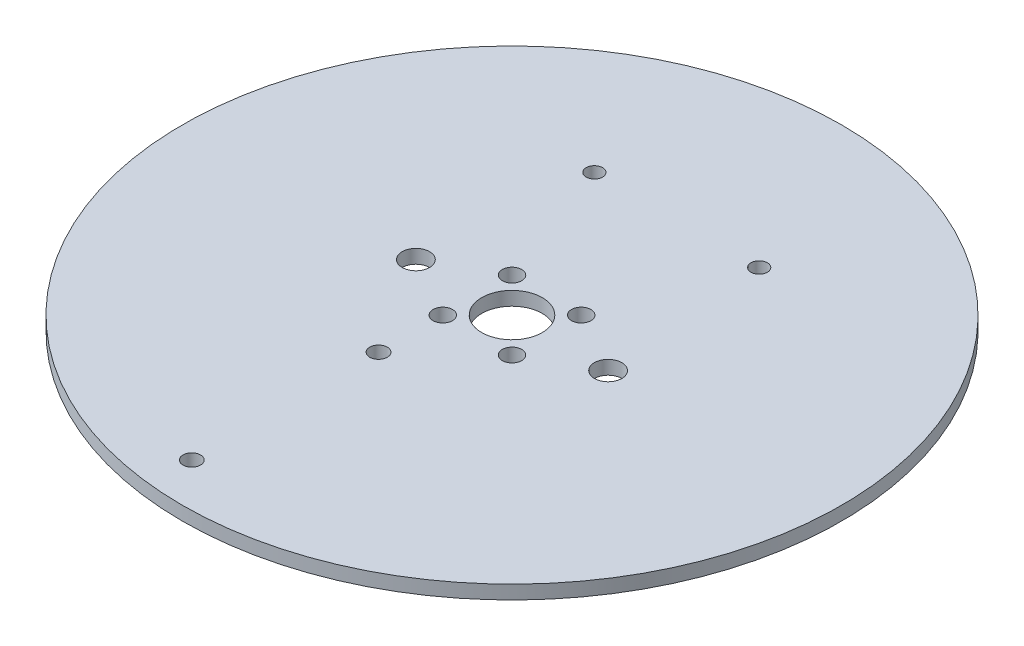
ISO-10303-21;
HEADER;
FILE_DESCRIPTION(('STEP AP214'),'2;1');
FILE_NAME('part.step','',(''),(''),'','','');
FILE_SCHEMA(('AUTOMOTIVE_DESIGN { 1 0 10303 214 1 1 1 1 }'));
ENDSEC;
DATA;
#1=APPLICATION_CONTEXT('core data for automotive mechanical design processes');
#2=APPLICATION_PROTOCOL_DEFINITION('international standard','automotive_design',2000,#1);
#3=PRODUCT_CONTEXT('',#1,'mechanical');
#4=PRODUCT('Part','Part','',(#3));
#5=PRODUCT_RELATED_PRODUCT_CATEGORY('part','',(#4));
#6=PRODUCT_DEFINITION_FORMATION('','',#4);
#7=PRODUCT_DEFINITION_CONTEXT('part definition',#1,'design');
#8=PRODUCT_DEFINITION('design','',#6,#7);
#9=PRODUCT_DEFINITION_SHAPE('','',#8);
#10=(LENGTH_UNIT() NAMED_UNIT(*) SI_UNIT(.MILLI.,.METRE.));
#11=(NAMED_UNIT(*) PLANE_ANGLE_UNIT() SI_UNIT($,.RADIAN.));
#12=(NAMED_UNIT(*) SI_UNIT($,.STERADIAN.) SOLID_ANGLE_UNIT());
#13=UNCERTAINTY_MEASURE_WITH_UNIT(LENGTH_MEASURE(1.E-05),#10,'distance_accuracy_value','');
#14=(GEOMETRIC_REPRESENTATION_CONTEXT(3) GLOBAL_UNCERTAINTY_ASSIGNED_CONTEXT((#13)) GLOBAL_UNIT_ASSIGNED_CONTEXT((#10,
#11,#12)) REPRESENTATION_CONTEXT('',''));
#15=CARTESIAN_POINT('',(0.,0.,0.));
#16=DIRECTION('',(0.,0.,1.));
#17=DIRECTION('',(1.,0.,0.));
#18=AXIS2_PLACEMENT_3D('',#15,#16,#17);
#19=CARTESIAN_POINT('',(0.,3.175,0.));
#20=DIRECTION('',(0.,-1.,0.));
#21=DIRECTION('',(0.,0.,-1.));
#22=AXIS2_PLACEMENT_3D('',#19,#20,#21);
#23=CYLINDRICAL_SURFACE('',#22,76.2);
#24=CARTESIAN_POINT('',(0.,3.175,0.));
#25=DIRECTION('',(0.,1.,0.));
#26=DIRECTION('',(0.,0.,1.));
#27=AXIS2_PLACEMENT_3D('',#24,#25,#26);
#28=CIRCLE('',#27,76.2);
#29=CARTESIAN_POINT('',(0.,3.175,76.2));
#30=VERTEX_POINT('',#29);
#31=EDGE_CURVE('E10',#30,#30,#28,.T.);
#32=ORIENTED_EDGE('',*,*,#31,.F.);
#33=EDGE_LOOP('',(#32));
#34=FACE_BOUND('',#33,.T.);
#35=CARTESIAN_POINT('',(0.,0.,0.));
#36=DIRECTION('',(0.,1.,0.));
#37=DIRECTION('',(0.,0.,1.));
#38=AXIS2_PLACEMENT_3D('',#35,#36,#37);
#39=CIRCLE('',#38,76.2);
#40=CARTESIAN_POINT('',(0.,0.,76.2));
#41=VERTEX_POINT('',#40);
#42=EDGE_CURVE('E34',#41,#41,#39,.T.);
#43=ORIENTED_EDGE('',*,*,#42,.T.);
#44=EDGE_LOOP('',(#43));
#45=FACE_BOUND('',#44,.T.);
#46=ADVANCED_FACE('F31',(#34,#45),#23,.T.);
#47=CARTESIAN_POINT('',(0.,3.175,0.));
#48=DIRECTION('',(0.,1.,0.));
#49=DIRECTION('',(0.,0.,1.));
#50=AXIS2_PLACEMENT_3D('',#47,#48,#49);
#51=PLANE('',#50);
#52=CARTESIAN_POINT('',(-8.,3.175,22.86));
#53=DIRECTION('',(0.,1.,0.));
#54=DIRECTION('',(0.,0.,1.));
#55=AXIS2_PLACEMENT_3D('',#52,#53,#54);
#56=CIRCLE('',#55,2.032);
#57=CARTESIAN_POINT('',(-8.,3.175,24.892));
#58=VERTEX_POINT('',#57);
#59=EDGE_CURVE('E103',#58,#58,#56,.F.);
#60=ORIENTED_EDGE('',*,*,#59,.T.);
#61=EDGE_LOOP('',(#60));
#62=FACE_BOUND('',#61,.T.);
#63=CARTESIAN_POINT('',(-8.,3.175,66.04));
#64=DIRECTION('',(0.,1.,0.));
#65=DIRECTION('',(0.,0.,1.));
#66=AXIS2_PLACEMENT_3D('',#63,#64,#65);
#67=CIRCLE('',#66,2.032);
#68=CARTESIAN_POINT('',(-8.,3.175,68.072));
#69=VERTEX_POINT('',#68);
#70=EDGE_CURVE('E97',#69,#69,#67,.F.);
#71=ORIENTED_EDGE('',*,*,#70,.T.);
#72=EDGE_LOOP('',(#71));
#73=FACE_BOUND('',#72,.T.);
#74=CARTESIAN_POINT('',(19.05,3.175,-38.1));
#75=DIRECTION('',(0.,1.,0.));
#76=DIRECTION('',(0.,0.,1.));
#77=AXIS2_PLACEMENT_3D('',#74,#75,#76);
#78=CIRCLE('',#77,1.89865000000001);
#79=CARTESIAN_POINT('',(19.05,3.175,-36.20135));
#80=VERTEX_POINT('',#79);
#81=EDGE_CURVE('E88',#80,#80,#78,.T.);
#82=ORIENTED_EDGE('',*,*,#81,.F.);
#83=EDGE_LOOP('',(#82));
#84=FACE_BOUND('',#83,.T.);
#85=CARTESIAN_POINT('',(-19.05,3.175,-38.1));
#86=DIRECTION('',(0.,1.,0.));
#87=DIRECTION('',(0.,0.,1.));
#88=AXIS2_PLACEMENT_3D('',#85,#86,#87);
#89=CIRCLE('',#88,1.89865);
#90=CARTESIAN_POINT('',(-19.05,3.175,-36.20135));
#91=VERTEX_POINT('',#90);
#92=EDGE_CURVE('E89',#91,#91,#89,.T.);
#93=ORIENTED_EDGE('',*,*,#92,.F.);
#94=EDGE_LOOP('',(#93));
#95=FACE_BOUND('',#94,.T.);
#96=CARTESIAN_POINT('',(-8.,3.175,-8.));
#97=DIRECTION('',(0.,1.,0.));
#98=DIRECTION('',(0.,0.,1.));
#99=AXIS2_PLACEMENT_3D('',#96,#97,#98);
#100=CIRCLE('',#99,2.25);
#101=CARTESIAN_POINT('',(-8.,3.175,-5.75));
#102=VERTEX_POINT('',#101);
#103=EDGE_CURVE('E81',#102,#102,#100,.T.);
#104=ORIENTED_EDGE('',*,*,#103,.F.);
#105=EDGE_LOOP('',(#104));
#106=FACE_BOUND('',#105,.T.);
#107=CARTESIAN_POINT('',(8.,3.175,-8.));
#108=DIRECTION('',(0.,1.,0.));
#109=DIRECTION('',(0.,0.,1.));
#110=AXIS2_PLACEMENT_3D('',#107,#108,#109);
#111=CIRCLE('',#110,2.25);
#112=CARTESIAN_POINT('',(8.,3.175,-5.75));
#113=VERTEX_POINT('',#112);
#114=EDGE_CURVE('E75',#113,#113,#111,.T.);
#115=ORIENTED_EDGE('',*,*,#114,.F.);
#116=EDGE_LOOP('',(#115));
#117=FACE_BOUND('',#116,.T.);
#118=CARTESIAN_POINT('',(8.,3.175,8.));
#119=DIRECTION('',(0.,1.,0.));
#120=DIRECTION('',(0.,0.,1.));
#121=AXIS2_PLACEMENT_3D('',#118,#119,#120);
#122=CIRCLE('',#121,2.25);
#123=CARTESIAN_POINT('',(8.,3.175,10.25));
#124=VERTEX_POINT('',#123);
#125=EDGE_CURVE('E69',#124,#124,#122,.T.);
#126=ORIENTED_EDGE('',*,*,#125,.F.);
#127=EDGE_LOOP('',(#126));
#128=FACE_BOUND('',#127,.T.);
#129=CARTESIAN_POINT('',(-8.,3.175,8.));
#130=DIRECTION('',(0.,1.,0.));
#131=DIRECTION('',(0.,0.,1.));
#132=AXIS2_PLACEMENT_3D('',#129,#130,#131);
#133=CIRCLE('',#132,2.25);
#134=CARTESIAN_POINT('',(-8.,3.175,10.25));
#135=VERTEX_POINT('',#134);
#136=EDGE_CURVE('E63',#135,#135,#133,.T.);
#137=ORIENTED_EDGE('',*,*,#136,.F.);
#138=EDGE_LOOP('',(#137));
#139=FACE_BOUND('',#138,.T.);
#140=CARTESIAN_POINT('',(-22.225,3.175,0.));
#141=DIRECTION('',(0.,1.,0.));
#142=DIRECTION('',(0.,0.,1.));
#143=AXIS2_PLACEMENT_3D('',#140,#141,#142);
#144=CIRCLE('',#143,3.17500000000001);
#145=CARTESIAN_POINT('',(-22.225,3.175,3.17500000000001));
#146=VERTEX_POINT('',#145);
#147=EDGE_CURVE('E56',#146,#146,#144,.T.);
#148=ORIENTED_EDGE('',*,*,#147,.F.);
#149=EDGE_LOOP('',(#148));
#150=FACE_BOUND('',#149,.T.);
#151=CARTESIAN_POINT('',(22.225,3.175,0.));
#152=DIRECTION('',(0.,1.,0.));
#153=DIRECTION('',(0.,0.,1.));
#154=AXIS2_PLACEMENT_3D('',#151,#152,#153);
#155=CIRCLE('',#154,3.17500000000001);
#156=CARTESIAN_POINT('',(22.225,3.175,3.17500000000001));
#157=VERTEX_POINT('',#156);
#158=EDGE_CURVE('E49',#157,#157,#155,.T.);
#159=ORIENTED_EDGE('',*,*,#158,.F.);
#160=EDGE_LOOP('',(#159));
#161=FACE_BOUND('',#160,.T.);
#162=CARTESIAN_POINT('',(0.,3.175,0.));
#163=DIRECTION('',(0.,1.,0.));
#164=DIRECTION('',(0.,0.,1.));
#165=AXIS2_PLACEMENT_3D('',#162,#163,#164);
#166=CIRCLE('',#165,7.);
#167=CARTESIAN_POINT('',(0.,3.175,7.));
#168=VERTEX_POINT('',#167);
#169=EDGE_CURVE('E45',#168,#168,#166,.T.);
#170=ORIENTED_EDGE('',*,*,#169,.F.);
#171=EDGE_LOOP('',(#170));
#172=FACE_BOUND('',#171,.T.);
#173=ORIENTED_EDGE('',*,*,#31,.T.);
#174=EDGE_LOOP('',(#173));
#175=FACE_BOUND('',#174,.T.);
#176=ADVANCED_FACE('F115',(#62,#73,#84,#95,#106,#117,#128,#139,#150,#161,#172,#175),#51,.T.);
#177=CARTESIAN_POINT('',(0.,0.,0.));
#178=DIRECTION('',(0.,1.,0.));
#179=DIRECTION('',(0.,0.,1.));
#180=AXIS2_PLACEMENT_3D('',#177,#178,#179);
#181=PLANE('',#180);
#182=CARTESIAN_POINT('',(-8.,0.,22.86));
#183=DIRECTION('',(0.,-1.,0.));
#184=DIRECTION('',(0.,0.,-1.));
#185=AXIS2_PLACEMENT_3D('',#182,#183,#184);
#186=CIRCLE('',#185,2.032);
#187=CARTESIAN_POINT('',(-8.,0.,20.828));
#188=VERTEX_POINT('',#187);
#189=EDGE_CURVE('E92',#188,#188,#186,.T.);
#190=ORIENTED_EDGE('',*,*,#189,.F.);
#191=EDGE_LOOP('',(#190));
#192=FACE_BOUND('',#191,.T.);
#193=CARTESIAN_POINT('',(-8.,0.,66.04));
#194=DIRECTION('',(0.,-1.,0.));
#195=DIRECTION('',(0.,0.,-1.));
#196=AXIS2_PLACEMENT_3D('',#193,#194,#195);
#197=CIRCLE('',#196,2.032);
#198=CARTESIAN_POINT('',(-8.,0.,64.008));
#199=VERTEX_POINT('',#198);
#200=EDGE_CURVE('E100',#199,#199,#197,.T.);
#201=ORIENTED_EDGE('',*,*,#200,.F.);
#202=EDGE_LOOP('',(#201));
#203=FACE_BOUND('',#202,.T.);
#204=CARTESIAN_POINT('',(19.05,0.,-38.1));
#205=DIRECTION('',(0.,1.,0.));
#206=DIRECTION('',(0.,0.,1.));
#207=AXIS2_PLACEMENT_3D('',#204,#205,#206);
#208=CIRCLE('',#207,1.89865000000001);
#209=CARTESIAN_POINT('',(19.05,0.,-36.20135));
#210=VERTEX_POINT('',#209);
#211=EDGE_CURVE('E84',#210,#210,#208,.F.);
#212=ORIENTED_EDGE('',*,*,#211,.F.);
#213=EDGE_LOOP('',(#212));
#214=FACE_BOUND('',#213,.T.);
#215=CARTESIAN_POINT('',(-19.05,0.,-38.1));
#216=DIRECTION('',(0.,1.,0.));
#217=DIRECTION('',(0.,0.,1.));
#218=AXIS2_PLACEMENT_3D('',#215,#216,#217);
#219=CIRCLE('',#218,1.89865);
#220=CARTESIAN_POINT('',(-19.05,0.,-36.20135));
#221=VERTEX_POINT('',#220);
#222=EDGE_CURVE('E85',#221,#221,#219,.F.);
#223=ORIENTED_EDGE('',*,*,#222,.F.);
#224=EDGE_LOOP('',(#223));
#225=FACE_BOUND('',#224,.T.);
#226=CARTESIAN_POINT('',(-8.,0.,-8.));
#227=DIRECTION('',(0.,1.,0.));
#228=DIRECTION('',(0.,0.,1.));
#229=AXIS2_PLACEMENT_3D('',#226,#227,#228);
#230=CIRCLE('',#229,2.25);
#231=CARTESIAN_POINT('',(-8.,0.,-5.75));
#232=VERTEX_POINT('',#231);
#233=EDGE_CURVE('E78',#232,#232,#230,.T.);
#234=ORIENTED_EDGE('',*,*,#233,.T.);
#235=EDGE_LOOP('',(#234));
#236=FACE_BOUND('',#235,.T.);
#237=CARTESIAN_POINT('',(8.,0.,-8.));
#238=DIRECTION('',(0.,1.,0.));
#239=DIRECTION('',(0.,0.,1.));
#240=AXIS2_PLACEMENT_3D('',#237,#238,#239);
#241=CIRCLE('',#240,2.25);
#242=CARTESIAN_POINT('',(8.,0.,-5.75));
#243=VERTEX_POINT('',#242);
#244=EDGE_CURVE('E72',#243,#243,#241,.T.);
#245=ORIENTED_EDGE('',*,*,#244,.T.);
#246=EDGE_LOOP('',(#245));
#247=FACE_BOUND('',#246,.T.);
#248=CARTESIAN_POINT('',(8.,0.,8.));
#249=DIRECTION('',(0.,1.,0.));
#250=DIRECTION('',(0.,0.,1.));
#251=AXIS2_PLACEMENT_3D('',#248,#249,#250);
#252=CIRCLE('',#251,2.25);
#253=CARTESIAN_POINT('',(8.,0.,10.25));
#254=VERTEX_POINT('',#253);
#255=EDGE_CURVE('E66',#254,#254,#252,.T.);
#256=ORIENTED_EDGE('',*,*,#255,.T.);
#257=EDGE_LOOP('',(#256));
#258=FACE_BOUND('',#257,.T.);
#259=CARTESIAN_POINT('',(-8.,0.,8.));
#260=DIRECTION('',(0.,1.,0.));
#261=DIRECTION('',(0.,0.,1.));
#262=AXIS2_PLACEMENT_3D('',#259,#260,#261);
#263=CIRCLE('',#262,2.25);
#264=CARTESIAN_POINT('',(-8.,0.,10.25));
#265=VERTEX_POINT('',#264);
#266=EDGE_CURVE('E53',#265,#265,#263,.T.);
#267=ORIENTED_EDGE('',*,*,#266,.T.);
#268=EDGE_LOOP('',(#267));
#269=FACE_BOUND('',#268,.T.);
#270=CARTESIAN_POINT('',(-22.225,0.,0.));
#271=DIRECTION('',(0.,1.,0.));
#272=DIRECTION('',(0.,0.,1.));
#273=AXIS2_PLACEMENT_3D('',#270,#271,#272);
#274=CIRCLE('',#273,3.17500000000001);
#275=CARTESIAN_POINT('',(-22.225,0.,3.17500000000001));
#276=VERTEX_POINT('',#275);
#277=EDGE_CURVE('E48',#276,#276,#274,.T.);
#278=ORIENTED_EDGE('',*,*,#277,.T.);
#279=EDGE_LOOP('',(#278));
#280=FACE_BOUND('',#279,.T.);
#281=CARTESIAN_POINT('',(22.225,0.,0.));
#282=DIRECTION('',(0.,1.,0.));
#283=DIRECTION('',(0.,0.,1.));
#284=AXIS2_PLACEMENT_3D('',#281,#282,#283);
#285=CIRCLE('',#284,3.17500000000001);
#286=CARTESIAN_POINT('',(22.225,0.,3.17500000000001));
#287=VERTEX_POINT('',#286);
#288=EDGE_CURVE('E52',#287,#287,#285,.T.);
#289=ORIENTED_EDGE('',*,*,#288,.T.);
#290=EDGE_LOOP('',(#289));
#291=FACE_BOUND('',#290,.T.);
#292=CARTESIAN_POINT('',(0.,0.,0.));
#293=DIRECTION('',(0.,1.,0.));
#294=DIRECTION('',(0.,0.,1.));
#295=AXIS2_PLACEMENT_3D('',#292,#293,#294);
#296=CIRCLE('',#295,7.);
#297=CARTESIAN_POINT('',(0.,0.,7.));
#298=VERTEX_POINT('',#297);
#299=EDGE_CURVE('E41',#298,#298,#296,.F.);
#300=ORIENTED_EDGE('',*,*,#299,.F.);
#301=EDGE_LOOP('',(#300));
#302=FACE_BOUND('',#301,.T.);
#303=ORIENTED_EDGE('',*,*,#42,.F.);
#304=EDGE_LOOP('',(#303));
#305=FACE_BOUND('',#304,.T.);
#306=ADVANCED_FACE('F111',(#192,#203,#214,#225,#236,#247,#258,#269,#280,#291,#302,#305),#181,.F.);
#307=CARTESIAN_POINT('',(0.,-0.00100000000000013,0.));
#308=DIRECTION('',(0.,1.,0.));
#309=DIRECTION('',(0.,0.,1.));
#310=AXIS2_PLACEMENT_3D('',#307,#308,#309);
#311=CYLINDRICAL_SURFACE('',#310,7.);
#312=ORIENTED_EDGE('',*,*,#169,.T.);
#313=EDGE_LOOP('',(#312));
#314=FACE_BOUND('',#313,.T.);
#315=ORIENTED_EDGE('',*,*,#299,.T.);
#316=EDGE_LOOP('',(#315));
#317=FACE_BOUND('',#316,.T.);
#318=ADVANCED_FACE('F114',(#314,#317),#311,.F.);
#319=CARTESIAN_POINT('',(22.225,0.,0.));
#320=DIRECTION('',(0.,1.,0.));
#321=DIRECTION('',(0.,0.,1.));
#322=AXIS2_PLACEMENT_3D('',#319,#320,#321);
#323=CYLINDRICAL_SURFACE('',#322,3.17500000000001);
#324=ORIENTED_EDGE('',*,*,#288,.F.);
#325=EDGE_LOOP('',(#324));
#326=FACE_BOUND('',#325,.T.);
#327=ORIENTED_EDGE('',*,*,#158,.T.);
#328=EDGE_LOOP('',(#327));
#329=FACE_BOUND('',#328,.T.);
#330=ADVANCED_FACE('F151',(#326,#329),#323,.F.);
#331=CARTESIAN_POINT('',(-22.225,0.,0.));
#332=DIRECTION('',(0.,1.,0.));
#333=DIRECTION('',(0.,0.,1.));
#334=AXIS2_PLACEMENT_3D('',#331,#332,#333);
#335=CYLINDRICAL_SURFACE('',#334,3.17500000000001);
#336=ORIENTED_EDGE('',*,*,#277,.F.);
#337=EDGE_LOOP('',(#336));
#338=FACE_BOUND('',#337,.T.);
#339=ORIENTED_EDGE('',*,*,#147,.T.);
#340=EDGE_LOOP('',(#339));
#341=FACE_BOUND('',#340,.T.);
#342=ADVANCED_FACE('F155',(#338,#341),#335,.F.);
#343=CARTESIAN_POINT('',(-8.,3.175,8.));
#344=DIRECTION('',(0.,1.,0.));
#345=DIRECTION('',(0.,0.,1.));
#346=AXIS2_PLACEMENT_3D('',#343,#344,#345);
#347=CYLINDRICAL_SURFACE('',#346,2.25);
#348=ORIENTED_EDGE('',*,*,#266,.F.);
#349=EDGE_LOOP('',(#348));
#350=FACE_BOUND('',#349,.T.);
#351=ORIENTED_EDGE('',*,*,#136,.T.);
#352=EDGE_LOOP('',(#351));
#353=FACE_BOUND('',#352,.T.);
#354=ADVANCED_FACE('F159',(#350,#353),#347,.F.);
#355=CARTESIAN_POINT('',(8.,3.175,8.));
#356=DIRECTION('',(0.,1.,0.));
#357=DIRECTION('',(0.,0.,1.));
#358=AXIS2_PLACEMENT_3D('',#355,#356,#357);
#359=CYLINDRICAL_SURFACE('',#358,2.25);
#360=ORIENTED_EDGE('',*,*,#255,.F.);
#361=EDGE_LOOP('',(#360));
#362=FACE_BOUND('',#361,.T.);
#363=ORIENTED_EDGE('',*,*,#125,.T.);
#364=EDGE_LOOP('',(#363));
#365=FACE_BOUND('',#364,.T.);
#366=ADVANCED_FACE('F163',(#362,#365),#359,.F.);
#367=CARTESIAN_POINT('',(8.,3.175,-8.));
#368=DIRECTION('',(0.,1.,0.));
#369=DIRECTION('',(0.,0.,1.));
#370=AXIS2_PLACEMENT_3D('',#367,#368,#369);
#371=CYLINDRICAL_SURFACE('',#370,2.25);
#372=ORIENTED_EDGE('',*,*,#244,.F.);
#373=EDGE_LOOP('',(#372));
#374=FACE_BOUND('',#373,.T.);
#375=ORIENTED_EDGE('',*,*,#114,.T.);
#376=EDGE_LOOP('',(#375));
#377=FACE_BOUND('',#376,.T.);
#378=ADVANCED_FACE('F167',(#374,#377),#371,.F.);
#379=CARTESIAN_POINT('',(-8.,3.175,-8.));
#380=DIRECTION('',(0.,1.,0.));
#381=DIRECTION('',(0.,0.,1.));
#382=AXIS2_PLACEMENT_3D('',#379,#380,#381);
#383=CYLINDRICAL_SURFACE('',#382,2.25);
#384=ORIENTED_EDGE('',*,*,#233,.F.);
#385=EDGE_LOOP('',(#384));
#386=FACE_BOUND('',#385,.T.);
#387=ORIENTED_EDGE('',*,*,#103,.T.);
#388=EDGE_LOOP('',(#387));
#389=FACE_BOUND('',#388,.T.);
#390=ADVANCED_FACE('F171',(#386,#389),#383,.F.);
#391=CARTESIAN_POINT('',(-19.05,-0.00100000000000013,-38.1));
#392=DIRECTION('',(0.,1.,0.));
#393=DIRECTION('',(0.,0.,1.));
#394=AXIS2_PLACEMENT_3D('',#391,#392,#393);
#395=CYLINDRICAL_SURFACE('',#394,1.89865);
#396=ORIENTED_EDGE('',*,*,#92,.T.);
#397=EDGE_LOOP('',(#396));
#398=FACE_BOUND('',#397,.T.);
#399=ORIENTED_EDGE('',*,*,#222,.T.);
#400=EDGE_LOOP('',(#399));
#401=FACE_BOUND('',#400,.T.);
#402=ADVANCED_FACE('F175',(#398,#401),#395,.F.);
#403=CARTESIAN_POINT('',(19.05,-0.00100000000000013,-38.1));
#404=DIRECTION('',(0.,1.,0.));
#405=DIRECTION('',(0.,0.,1.));
#406=AXIS2_PLACEMENT_3D('',#403,#404,#405);
#407=CYLINDRICAL_SURFACE('',#406,1.89865000000001);
#408=ORIENTED_EDGE('',*,*,#81,.T.);
#409=EDGE_LOOP('',(#408));
#410=FACE_BOUND('',#409,.T.);
#411=ORIENTED_EDGE('',*,*,#211,.T.);
#412=EDGE_LOOP('',(#411));
#413=FACE_BOUND('',#412,.T.);
#414=ADVANCED_FACE('F179',(#410,#413),#407,.F.);
#415=CARTESIAN_POINT('',(-8.,3.176,66.04));
#416=DIRECTION('',(0.,-1.,0.));
#417=DIRECTION('',(0.,0.,-1.));
#418=AXIS2_PLACEMENT_3D('',#415,#416,#417);
#419=CYLINDRICAL_SURFACE('',#418,2.032);
#420=ORIENTED_EDGE('',*,*,#70,.F.);
#421=EDGE_LOOP('',(#420));
#422=FACE_BOUND('',#421,.T.);
#423=ORIENTED_EDGE('',*,*,#200,.T.);
#424=EDGE_LOOP('',(#423));
#425=FACE_BOUND('',#424,.T.);
#426=ADVANCED_FACE('F183',(#422,#425),#419,.F.);
#427=CARTESIAN_POINT('',(-8.,3.176,22.86));
#428=DIRECTION('',(0.,-1.,0.));
#429=DIRECTION('',(0.,0.,-1.));
#430=AXIS2_PLACEMENT_3D('',#427,#428,#429);
#431=CYLINDRICAL_SURFACE('',#430,2.032);
#432=ORIENTED_EDGE('',*,*,#59,.F.);
#433=EDGE_LOOP('',(#432));
#434=FACE_BOUND('',#433,.T.);
#435=ORIENTED_EDGE('',*,*,#189,.T.);
#436=EDGE_LOOP('',(#435));
#437=FACE_BOUND('',#436,.T.);
#438=ADVANCED_FACE('F109',(#434,#437),#431,.F.);
#439=CLOSED_SHELL('',(#46,#176,#306,#318,#330,#342,#354,#366,#378,#390,#402,#414,#426,#438));
#440=MANIFOLD_SOLID_BREP('B2',#439);
#441=ADVANCED_BREP_SHAPE_REPRESENTATION('',(#18,#440),#14);
#442=SHAPE_DEFINITION_REPRESENTATION(#9,#441);
ENDSEC;
END-ISO-10303-21;
